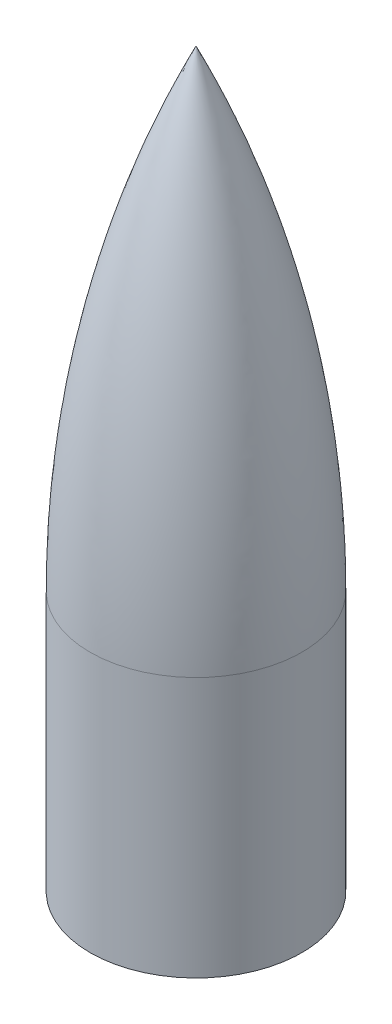
ISO-10303-21;
HEADER;
FILE_DESCRIPTION(('STEP AP214'),'2;1');
FILE_NAME('part.step','',(''),(''),'','','');
FILE_SCHEMA(('AUTOMOTIVE_DESIGN { 1 0 10303 214 1 1 1 1 }'));
ENDSEC;
DATA;
#1=APPLICATION_CONTEXT('core data for automotive mechanical design processes');
#2=APPLICATION_PROTOCOL_DEFINITION('international standard','automotive_design',2000,#1);
#3=PRODUCT_CONTEXT('',#1,'mechanical');
#4=PRODUCT('Part','Part','',(#3));
#5=PRODUCT_RELATED_PRODUCT_CATEGORY('part','',(#4));
#6=PRODUCT_DEFINITION_FORMATION('','',#4);
#7=PRODUCT_DEFINITION_CONTEXT('part definition',#1,'design');
#8=PRODUCT_DEFINITION('design','',#6,#7);
#9=PRODUCT_DEFINITION_SHAPE('','',#8);
#10=(LENGTH_UNIT() NAMED_UNIT(*) SI_UNIT(.MILLI.,.METRE.));
#11=(NAMED_UNIT(*) PLANE_ANGLE_UNIT() SI_UNIT($,.RADIAN.));
#12=(NAMED_UNIT(*) SI_UNIT($,.STERADIAN.) SOLID_ANGLE_UNIT());
#13=UNCERTAINTY_MEASURE_WITH_UNIT(LENGTH_MEASURE(1.E-05),#10,'distance_accuracy_value','');
#14=(GEOMETRIC_REPRESENTATION_CONTEXT(3) GLOBAL_UNCERTAINTY_ASSIGNED_CONTEXT((#13)) GLOBAL_UNIT_ASSIGNED_CONTEXT((#10,
#11,#12)) REPRESENTATION_CONTEXT('',''));
#15=CARTESIAN_POINT('',(0.,0.,0.));
#16=DIRECTION('',(0.,0.,1.));
#17=DIRECTION('',(1.,0.,0.));
#18=AXIS2_PLACEMENT_3D('',#15,#16,#17);
#19=CARTESIAN_POINT('',(0.,0.,0.));
#20=DIRECTION('',(0.,1.,0.));
#21=DIRECTION('',(0.,0.,1.));
#22=AXIS2_PLACEMENT_3D('',#19,#20,#21);
#23=PLANE('',#22);
#24=CARTESIAN_POINT('',(0.,0.,0.));
#25=DIRECTION('',(0.,-1.,0.));
#26=DIRECTION('',(0.,0.,-1.));
#27=AXIS2_PLACEMENT_3D('',#24,#25,#26);
#28=CIRCLE('',#27,2.85);
#29=CARTESIAN_POINT('',(0.,0.,-2.85));
#30=VERTEX_POINT('',#29);
#31=EDGE_CURVE('E11',#30,#30,#28,.T.);
#32=ORIENTED_EDGE('',*,*,#31,.T.);
#33=EDGE_LOOP('',(#32));
#34=FACE_BOUND('',#33,.T.);
#35=ADVANCED_FACE('F32',(#34),#23,.F.);
#36=CARTESIAN_POINT('',(0.,0.,0.));
#37=DIRECTION('',(0.,-1.,0.));
#38=DIRECTION('',(0.,0.,-1.));
#39=AXIS2_PLACEMENT_3D('',#36,#37,#38);
#40=CYLINDRICAL_SURFACE('',#39,2.85);
#41=ORIENTED_EDGE('',*,*,#31,.F.);
#42=EDGE_LOOP('',(#41));
#43=FACE_BOUND('',#42,.T.);
#44=CARTESIAN_POINT('',(0.,7.,0.));
#45=DIRECTION('',(0.,-1.,0.));
#46=DIRECTION('',(0.,0.,-1.));
#47=AXIS2_PLACEMENT_3D('',#44,#45,#46);
#48=CIRCLE('',#47,2.85);
#49=CARTESIAN_POINT('',(0.,7.,-2.85));
#50=VERTEX_POINT('',#49);
#51=EDGE_CURVE('E38',#50,#50,#48,.T.);
#52=ORIENTED_EDGE('',*,*,#51,.T.);
#53=EDGE_LOOP('',(#52));
#54=FACE_BOUND('',#53,.T.);
#55=ADVANCED_FACE('F43',(#43,#54),#40,.T.);
#56=CARTESIAN_POINT('',(0.,7.,26.8714912280702));
#57=DIRECTION('',(-1.,0.,0.));
#58=DIRECTION('',(0.,0.,-1.));
#59=AXIS2_PLACEMENT_3D('',#56,#57,#58);
#60=CIRCLE('',#59,29.7214912280702);
#61=TRIMMED_CURVE('',#60,(PARAMETER_VALUE(-0.441504552386403)),
(PARAMETER_VALUE(0.441504552386403)),.T.,.PARAMETER.);
#62=CARTESIAN_POINT('',(0.,7.,0.));
#63=DIRECTION('',(0.,-1.,0.));
#64=AXIS1_PLACEMENT('',#62,#63);
#65=SURFACE_OF_REVOLUTION('',#61,#64);
#66=ORIENTED_EDGE('',*,*,#51,.F.);
#67=EDGE_LOOP('',(#66));
#68=FACE_BOUND('',#67,.T.);
#69=CARTESIAN_POINT('',(0.,19.7,0.));
#70=VERTEX_POINT('',#69);
#71=VERTEX_LOOP('',#70);
#72=FACE_BOUND('',#71,.T.);
#73=ADVANCED_FACE('F41',(#68,#72),#65,.T.);
#74=CLOSED_SHELL('',(#35,#55,#73));
#75=MANIFOLD_SOLID_BREP('B2',#74);
#76=ADVANCED_BREP_SHAPE_REPRESENTATION('',(#18,#75),#14);
#77=SHAPE_DEFINITION_REPRESENTATION(#9,#76);
ENDSEC;
END-ISO-10303-21;
